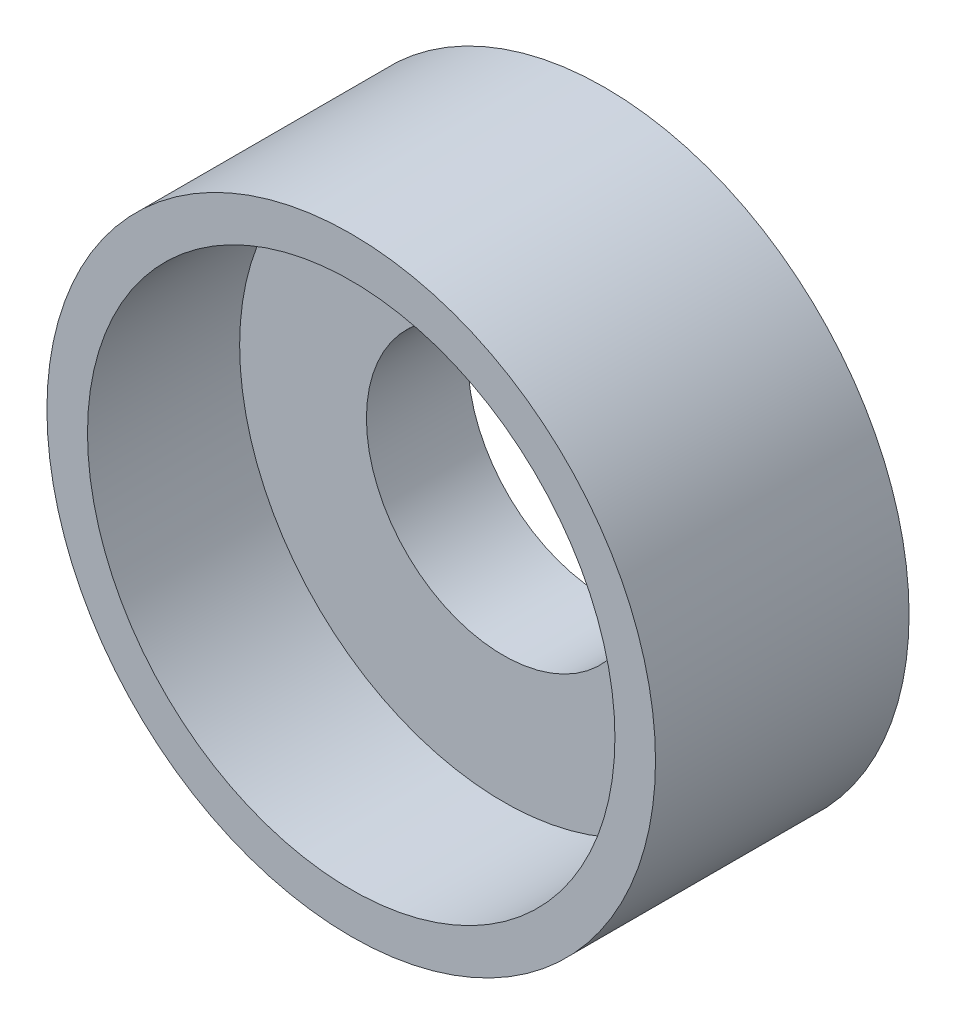
ISO-10303-21;
HEADER;
FILE_DESCRIPTION(('STEP AP214'),'2;1');
FILE_NAME('part.step','',(''),(''),'','','');
FILE_SCHEMA(('AUTOMOTIVE_DESIGN { 1 0 10303 214 1 1 1 1 }'));
ENDSEC;
DATA;
#1=APPLICATION_CONTEXT('core data for automotive mechanical design processes');
#2=APPLICATION_PROTOCOL_DEFINITION('international standard','automotive_design',2000,#1);
#3=PRODUCT_CONTEXT('',#1,'mechanical');
#4=PRODUCT('Part','Part','',(#3));
#5=PRODUCT_RELATED_PRODUCT_CATEGORY('part','',(#4));
#6=PRODUCT_DEFINITION_FORMATION('','',#4);
#7=PRODUCT_DEFINITION_CONTEXT('part definition',#1,'design');
#8=PRODUCT_DEFINITION('design','',#6,#7);
#9=PRODUCT_DEFINITION_SHAPE('','',#8);
#10=(LENGTH_UNIT() NAMED_UNIT(*) SI_UNIT(.MILLI.,.METRE.));
#11=(NAMED_UNIT(*) PLANE_ANGLE_UNIT() SI_UNIT($,.RADIAN.));
#12=(NAMED_UNIT(*) SI_UNIT($,.STERADIAN.) SOLID_ANGLE_UNIT());
#13=UNCERTAINTY_MEASURE_WITH_UNIT(LENGTH_MEASURE(1.E-05),#10,'distance_accuracy_value','');
#14=(GEOMETRIC_REPRESENTATION_CONTEXT(3) GLOBAL_UNCERTAINTY_ASSIGNED_CONTEXT((#13)) GLOBAL_UNIT_ASSIGNED_CONTEXT((#10,
#11,#12)) REPRESENTATION_CONTEXT('',''));
#15=CARTESIAN_POINT('',(0.,0.,0.));
#16=DIRECTION('',(0.,0.,1.));
#17=DIRECTION('',(1.,0.,0.));
#18=AXIS2_PLACEMENT_3D('',#15,#16,#17);
#19=CARTESIAN_POINT('',(0.,0.,25.));
#20=DIRECTION('',(0.,0.,-1.));
#21=DIRECTION('',(-1.,0.,0.));
#22=AXIS2_PLACEMENT_3D('',#19,#20,#21);
#23=CYLINDRICAL_SURFACE('',#22,26.);
#24=CARTESIAN_POINT('',(0.,0.,25.));
#25=DIRECTION('',(0.,0.,1.));
#26=DIRECTION('',(1.,0.,0.));
#27=AXIS2_PLACEMENT_3D('',#24,#25,#26);
#28=CIRCLE('',#27,26.);
#29=CARTESIAN_POINT('',(26.,0.,25.));
#30=VERTEX_POINT('',#29);
#31=EDGE_CURVE('E42',#30,#30,#28,.T.);
#32=ORIENTED_EDGE('',*,*,#31,.T.);
#33=EDGE_LOOP('',(#32));
#34=FACE_BOUND('',#33,.T.);
#35=CARTESIAN_POINT('',(0.,0.,10.));
#36=DIRECTION('',(0.,0.,-1.));
#37=DIRECTION('',(-1.,0.,0.));
#38=AXIS2_PLACEMENT_3D('',#35,#36,#37);
#39=CIRCLE('',#38,26.);
#40=CARTESIAN_POINT('',(-26.,0.,10.));
#41=VERTEX_POINT('',#40);
#42=EDGE_CURVE('E46',#41,#41,#39,.T.);
#43=ORIENTED_EDGE('',*,*,#42,.T.);
#44=EDGE_LOOP('',(#43));
#45=FACE_BOUND('',#44,.T.);
#46=ADVANCED_FACE('F31',(#34,#45),#23,.F.);
#47=CARTESIAN_POINT('',(0.,0.,25.));
#48=DIRECTION('',(0.,0.,1.));
#49=DIRECTION('',(1.,0.,0.));
#50=AXIS2_PLACEMENT_3D('',#47,#48,#49);
#51=PLANE('',#50);
#52=CARTESIAN_POINT('',(0.,0.,25.));
#53=DIRECTION('',(0.,0.,1.));
#54=DIRECTION('',(1.,0.,0.));
#55=AXIS2_PLACEMENT_3D('',#52,#53,#54);
#56=CIRCLE('',#55,30.);
#57=CARTESIAN_POINT('',(30.,0.,25.));
#58=VERTEX_POINT('',#57);
#59=EDGE_CURVE('E10',#58,#58,#56,.T.);
#60=ORIENTED_EDGE('',*,*,#59,.T.);
#61=EDGE_LOOP('',(#60));
#62=FACE_BOUND('',#61,.T.);
#63=ORIENTED_EDGE('',*,*,#31,.F.);
#64=EDGE_LOOP('',(#63));
#65=FACE_BOUND('',#64,.T.);
#66=ADVANCED_FACE('F67',(#62,#65),#51,.T.);
#67=CARTESIAN_POINT('',(0.,0.,0.));
#68=DIRECTION('',(0.,0.,1.));
#69=DIRECTION('',(1.,0.,0.));
#70=AXIS2_PLACEMENT_3D('',#67,#68,#69);
#71=PLANE('',#70);
#72=CARTESIAN_POINT('',(0.,0.,0.));
#73=DIRECTION('',(0.,0.,1.));
#74=DIRECTION('',(1.,0.,0.));
#75=AXIS2_PLACEMENT_3D('',#72,#73,#74);
#76=CIRCLE('',#75,30.);
#77=CARTESIAN_POINT('',(30.,0.,0.));
#78=VERTEX_POINT('',#77);
#79=EDGE_CURVE('E35',#78,#78,#76,.T.);
#80=ORIENTED_EDGE('',*,*,#79,.F.);
#81=EDGE_LOOP('',(#80));
#82=FACE_BOUND('',#81,.T.);
#83=CARTESIAN_POINT('',(0.,0.,0.));
#84=DIRECTION('',(0.,0.,-1.));
#85=DIRECTION('',(-1.,0.,0.));
#86=AXIS2_PLACEMENT_3D('',#83,#84,#85);
#87=CIRCLE('',#86,13.5);
#88=CARTESIAN_POINT('',(-13.5,0.,0.));
#89=VERTEX_POINT('',#88);
#90=EDGE_CURVE('E50',#89,#89,#87,.T.);
#91=ORIENTED_EDGE('',*,*,#90,.F.);
#92=EDGE_LOOP('',(#91));
#93=FACE_BOUND('',#92,.T.);
#94=ADVANCED_FACE('F65',(#82,#93),#71,.F.);
#95=CARTESIAN_POINT('',(0.,0.,25.));
#96=DIRECTION('',(0.,0.,-1.));
#97=DIRECTION('',(-1.,0.,0.));
#98=AXIS2_PLACEMENT_3D('',#95,#96,#97);
#99=CYLINDRICAL_SURFACE('',#98,30.);
#100=ORIENTED_EDGE('',*,*,#59,.F.);
#101=EDGE_LOOP('',(#100));
#102=FACE_BOUND('',#101,.T.);
#103=ORIENTED_EDGE('',*,*,#79,.T.);
#104=EDGE_LOOP('',(#103));
#105=FACE_BOUND('',#104,.T.);
#106=ADVANCED_FACE('F33',(#102,#105),#99,.T.);
#107=CARTESIAN_POINT('',(0.,0.,10.));
#108=DIRECTION('',(0.,0.,-1.));
#109=DIRECTION('',(-1.,0.,0.));
#110=AXIS2_PLACEMENT_3D('',#107,#108,#109);
#111=PLANE('',#110);
#112=CARTESIAN_POINT('',(0.,0.,10.));
#113=DIRECTION('',(0.,0.,-1.));
#114=DIRECTION('',(-1.,0.,0.));
#115=AXIS2_PLACEMENT_3D('',#112,#113,#114);
#116=CIRCLE('',#115,13.5);
#117=CARTESIAN_POINT('',(-13.5,0.,10.));
#118=VERTEX_POINT('',#117);
#119=EDGE_CURVE('E49',#118,#118,#116,.T.);
#120=ORIENTED_EDGE('',*,*,#119,.T.);
#121=EDGE_LOOP('',(#120));
#122=FACE_BOUND('',#121,.T.);
#123=ORIENTED_EDGE('',*,*,#42,.F.);
#124=EDGE_LOOP('',(#123));
#125=FACE_BOUND('',#124,.T.);
#126=ADVANCED_FACE('F56',(#122,#125),#111,.F.);
#127=CARTESIAN_POINT('',(0.,0.,10.));
#128=DIRECTION('',(0.,0.,-1.));
#129=DIRECTION('',(-1.,0.,0.));
#130=AXIS2_PLACEMENT_3D('',#127,#128,#129);
#131=CYLINDRICAL_SURFACE('',#130,13.5);
#132=ORIENTED_EDGE('',*,*,#119,.F.);
#133=EDGE_LOOP('',(#132));
#134=FACE_BOUND('',#133,.T.);
#135=ORIENTED_EDGE('',*,*,#90,.T.);
#136=EDGE_LOOP('',(#135));
#137=FACE_BOUND('',#136,.T.);
#138=ADVANCED_FACE('F59',(#134,#137),#131,.F.);
#139=CLOSED_SHELL('',(#46,#66,#94,#106,#126,#138));
#140=MANIFOLD_SOLID_BREP('B2',#139);
#141=ADVANCED_BREP_SHAPE_REPRESENTATION('',(#18,#140),#14);
#142=SHAPE_DEFINITION_REPRESENTATION(#9,#141);
ENDSEC;
END-ISO-10303-21;
